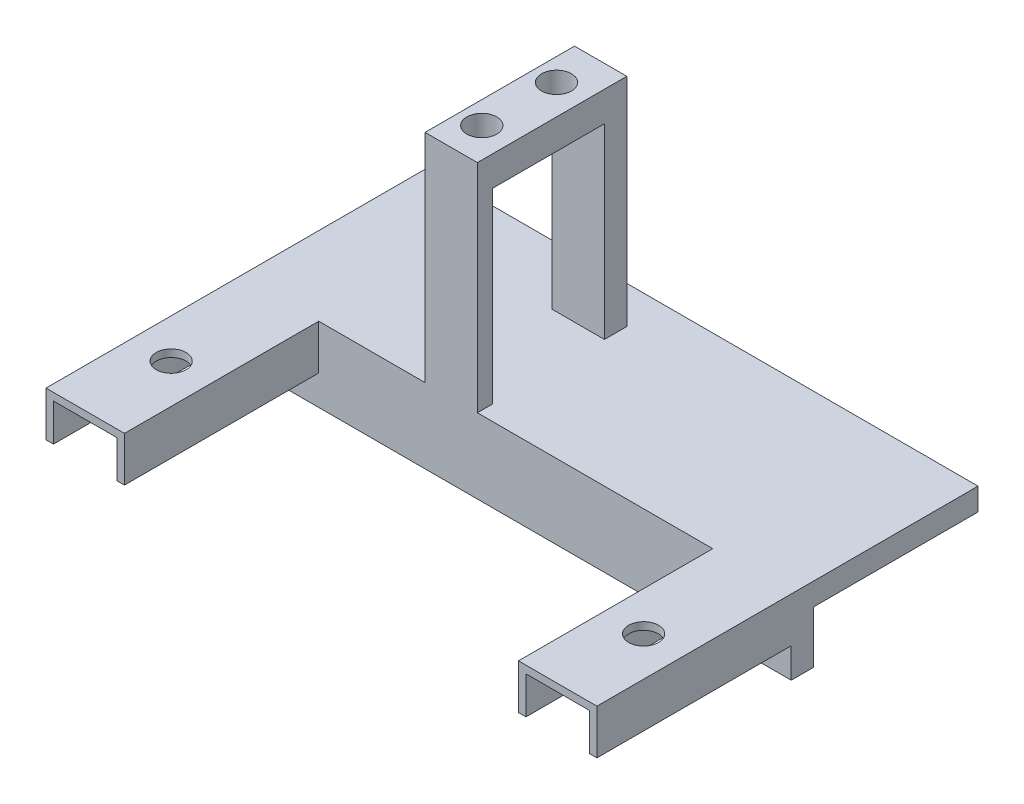
ISO-10303-21;
HEADER;
FILE_DESCRIPTION(('STEP AP214'),'2;1');
FILE_NAME('part.step','',(''),(''),'','','');
FILE_SCHEMA(('AUTOMOTIVE_DESIGN { 1 0 10303 214 1 1 1 1 }'));
ENDSEC;
DATA;
#1=APPLICATION_CONTEXT('core data for automotive mechanical design processes');
#2=APPLICATION_PROTOCOL_DEFINITION('international standard','automotive_design',2000,#1);
#3=PRODUCT_CONTEXT('',#1,'mechanical');
#4=PRODUCT('Part','Part','',(#3));
#5=PRODUCT_RELATED_PRODUCT_CATEGORY('part','',(#4));
#6=PRODUCT_DEFINITION_FORMATION('','',#4);
#7=PRODUCT_DEFINITION_CONTEXT('part definition',#1,'design');
#8=PRODUCT_DEFINITION('design','',#6,#7);
#9=PRODUCT_DEFINITION_SHAPE('','',#8);
#10=(LENGTH_UNIT() NAMED_UNIT(*) SI_UNIT(.MILLI.,.METRE.));
#11=(NAMED_UNIT(*) PLANE_ANGLE_UNIT() SI_UNIT($,.RADIAN.));
#12=(NAMED_UNIT(*) SI_UNIT($,.STERADIAN.) SOLID_ANGLE_UNIT());
#13=UNCERTAINTY_MEASURE_WITH_UNIT(LENGTH_MEASURE(1.E-05),#10,'distance_accuracy_value','');
#14=(GEOMETRIC_REPRESENTATION_CONTEXT(3) GLOBAL_UNCERTAINTY_ASSIGNED_CONTEXT((#13)) GLOBAL_UNIT_ASSIGNED_CONTEXT((#10,
#11,#12)) REPRESENTATION_CONTEXT('',''));
#15=CARTESIAN_POINT('',(0.,0.,0.));
#16=DIRECTION('',(0.,0.,1.));
#17=DIRECTION('',(1.,0.,0.));
#18=AXIS2_PLACEMENT_3D('',#15,#16,#17);
#19=CARTESIAN_POINT('',(0.,10.,3.));
#20=DIRECTION('',(0.,-1.,0.));
#21=DIRECTION('',(0.,0.,-1.));
#22=AXIS2_PLACEMENT_3D('',#19,#20,#21);
#23=PLANE('',#22);
#24=DIRECTION('',(0.,0.,-1.));
#25=VECTOR('',#24,1.);
#26=CARTESIAN_POINT('',(73.73,10.,3.));
#27=LINE('',#26,#25);
#28=CARTESIAN_POINT('',(73.73,10.,29.));
#29=VERTEX_POINT('',#28);
#30=CARTESIAN_POINT('',(73.73,10.,-22.));
#31=VERTEX_POINT('',#30);
#32=EDGE_CURVE('E510',#29,#31,#27,.T.);
#33=ORIENTED_EDGE('',*,*,#32,.T.);
#34=DIRECTION('',(1.,0.,0.));
#35=VECTOR('',#34,1.);
#36=CARTESIAN_POINT('',(73.73,10.,-22.));
#37=LINE('',#36,#35);
#38=CARTESIAN_POINT('',(0.,10.,-22.));
#39=VERTEX_POINT('',#38);
#40=EDGE_CURVE('E304',#39,#31,#37,.T.);
#41=ORIENTED_EDGE('',*,*,#40,.F.);
#42=DIRECTION('',(0.,0.,-1.));
#43=VECTOR('',#42,1.);
#44=CARTESIAN_POINT('',(0.,10.,3.));
#45=LINE('',#44,#43);
#46=CARTESIAN_POINT('',(0.,10.,29.));
#47=VERTEX_POINT('',#46);
#48=EDGE_CURVE('E499',#47,#39,#45,.T.);
#49=ORIENTED_EDGE('',*,*,#48,.F.);
#50=DIRECTION('',(-1.,0.,0.));
#51=VECTOR('',#50,1.);
#52=CARTESIAN_POINT('',(0.,10.,29.));
#53=LINE('',#52,#51);
#54=CARTESIAN_POINT('',(10.5,10.,29.));
#55=VERTEX_POINT('',#54);
#56=EDGE_CURVE('E428',#55,#47,#53,.T.);
#57=ORIENTED_EDGE('',*,*,#56,.F.);
#58=DIRECTION('',(0.,0.,-1.));
#59=VECTOR('',#58,1.);
#60=CARTESIAN_POINT('',(10.5,10.,29.));
#61=LINE('',#60,#59);
#62=CARTESIAN_POINT('',(10.5,10.,3.));
#63=VERTEX_POINT('',#62);
#64=EDGE_CURVE('E461',#55,#63,#61,.T.);
#65=ORIENTED_EDGE('',*,*,#64,.T.);
#66=DIRECTION('',(-1.,0.,0.));
#67=VECTOR('',#66,1.);
#68=CARTESIAN_POINT('',(0.,10.,3.));
#69=LINE('',#68,#67);
#70=CARTESIAN_POINT('',(24.73,10.,3.));
#71=VERTEX_POINT('',#70);
#72=EDGE_CURVE('E253',#71,#63,#69,.T.);
#73=ORIENTED_EDGE('',*,*,#72,.F.);
#74=DIRECTION('',(0.,0.,1.));
#75=VECTOR('',#74,1.);
#76=CARTESIAN_POINT('',(24.73,10.,3.));
#77=LINE('',#76,#75);
#78=CARTESIAN_POINT('',(24.73,10.,1.));
#79=VERTEX_POINT('',#78);
#80=EDGE_CURVE('E245',#79,#71,#77,.T.);
#81=ORIENTED_EDGE('',*,*,#80,.F.);
#82=DIRECTION('',(-1.,0.,0.));
#83=VECTOR('',#82,1.);
#84=CARTESIAN_POINT('',(73.73,10.,1.));
#85=LINE('',#84,#83);
#86=CARTESIAN_POINT('',(31.73,10.,1.));
#87=VERTEX_POINT('',#86);
#88=EDGE_CURVE('E69',#87,#79,#85,.T.);
#89=ORIENTED_EDGE('',*,*,#88,.F.);
#90=DIRECTION('',(0.,0.,-1.));
#91=VECTOR('',#90,1.);
#92=CARTESIAN_POINT('',(31.73,10.,3.));
#93=LINE('',#92,#91);
#94=CARTESIAN_POINT('',(31.73,10.,3.));
#95=VERTEX_POINT('',#94);
#96=EDGE_CURVE('E269',#95,#87,#93,.T.);
#97=ORIENTED_EDGE('',*,*,#96,.F.);
#98=CARTESIAN_POINT('',(63.23,10.,3.));
#99=VERTEX_POINT('',#98);
#100=EDGE_CURVE('E495',#99,#95,#69,.T.);
#101=ORIENTED_EDGE('',*,*,#100,.F.);
#102=DIRECTION('',(0.,0.,-1.));
#103=VECTOR('',#102,1.);
#104=CARTESIAN_POINT('',(63.23,10.,29.));
#105=LINE('',#104,#103);
#106=CARTESIAN_POINT('',(63.23,10.,29.));
#107=VERTEX_POINT('',#106);
#108=EDGE_CURVE('E403',#107,#99,#105,.T.);
#109=ORIENTED_EDGE('',*,*,#108,.F.);
#110=DIRECTION('',(-1.,0.,0.));
#111=VECTOR('',#110,1.);
#112=CARTESIAN_POINT('',(63.23,10.,29.));
#113=LINE('',#112,#111);
#114=EDGE_CURVE('E328',#29,#107,#113,.T.);
#115=ORIENTED_EDGE('',*,*,#114,.F.);
#116=EDGE_LOOP('',(#33,#41,#49,#57,#65,#73,#81,#89,#97,#101,#109,#115));
#117=FACE_BOUND('',#116,.T.);
#118=CARTESIAN_POINT('',(68.48,10.,17.5));
#119=DIRECTION('',(0.,1.,0.));
#120=DIRECTION('',(0.,0.,1.));
#121=AXIS2_PLACEMENT_3D('',#118,#119,#120);
#122=CIRCLE('',#121,2.);
#123=CARTESIAN_POINT('',(68.48,10.,19.5));
#124=VERTEX_POINT('',#123);
#125=EDGE_CURVE('E319',#124,#124,#122,.T.);
#126=ORIENTED_EDGE('',*,*,#125,.F.);
#127=EDGE_LOOP('',(#126));
#128=FACE_BOUND('',#127,.T.);
#129=CARTESIAN_POINT('',(31.73,10.,-14.));
#130=VERTEX_POINT('',#129);
#131=CARTESIAN_POINT('',(31.73,10.,-17.));
#132=VERTEX_POINT('',#131);
#133=EDGE_CURVE('E261',#130,#132,#93,.T.);
#134=ORIENTED_EDGE('',*,*,#133,.F.);
#135=DIRECTION('',(-1.,0.,0.));
#136=VECTOR('',#135,1.);
#137=CARTESIAN_POINT('',(73.73,10.,-14.));
#138=LINE('',#137,#136);
#139=CARTESIAN_POINT('',(24.73,10.,-14.));
#140=VERTEX_POINT('',#139);
#141=EDGE_CURVE('E239',#130,#140,#138,.T.);
#142=ORIENTED_EDGE('',*,*,#141,.T.);
#143=CARTESIAN_POINT('',(24.73,10.,-17.));
#144=VERTEX_POINT('',#143);
#145=EDGE_CURVE('E256',#144,#140,#77,.T.);
#146=ORIENTED_EDGE('',*,*,#145,.F.);
#147=DIRECTION('',(-1.,0.,0.));
#148=VECTOR('',#147,1.);
#149=CARTESIAN_POINT('',(24.73,10.,-17.));
#150=LINE('',#149,#148);
#151=EDGE_CURVE('E272',#132,#144,#150,.T.);
#152=ORIENTED_EDGE('',*,*,#151,.F.);
#153=EDGE_LOOP('',(#134,#142,#146,#152));
#154=FACE_BOUND('',#153,.T.);
#155=CARTESIAN_POINT('',(5.24999999999999,10.,17.5));
#156=DIRECTION('',(0.,1.,0.));
#157=DIRECTION('',(0.,0.,1.));
#158=AXIS2_PLACEMENT_3D('',#155,#156,#157);
#159=CIRCLE('',#158,2.);
#160=CARTESIAN_POINT('',(5.24999999999999,10.,19.5));
#161=VERTEX_POINT('',#160);
#162=EDGE_CURVE('E320',#161,#161,#159,.T.);
#163=ORIENTED_EDGE('',*,*,#162,.F.);
#164=EDGE_LOOP('',(#163));
#165=FACE_BOUND('',#164,.T.);
#166=ADVANCED_FACE('F45',(#117,#128,#154,#165),#23,.F.);
#167=CARTESIAN_POINT('',(0.,0.,3.));
#168=DIRECTION('',(0.,0.,-1.));
#169=DIRECTION('',(-1.,0.,0.));
#170=AXIS2_PLACEMENT_3D('',#167,#168,#169);
#171=PLANE('',#170);
#172=DIRECTION('',(0.,-1.,0.));
#173=VECTOR('',#172,1.);
#174=CARTESIAN_POINT('',(63.23,4.,3.));
#175=LINE('',#174,#173);
#176=CARTESIAN_POINT('',(63.23,4.,3.));
#177=VERTEX_POINT('',#176);
#178=EDGE_CURVE('E356',#99,#177,#175,.T.);
#179=ORIENTED_EDGE('',*,*,#178,.F.);
#180=ORIENTED_EDGE('',*,*,#100,.T.);
#181=DIRECTION('',(0.,-1.,0.));
#182=VECTOR('',#181,1.);
#183=CARTESIAN_POINT('',(31.73,39.,3.));
#184=LINE('',#183,#182);
#185=CARTESIAN_POINT('',(31.73,39.,3.));
#186=VERTEX_POINT('',#185);
#187=EDGE_CURVE('E285',#186,#95,#184,.T.);
#188=ORIENTED_EDGE('',*,*,#187,.F.);
#189=DIRECTION('',(1.,0.,0.));
#190=VECTOR('',#189,1.);
#191=CARTESIAN_POINT('',(24.73,39.,3.));
#192=LINE('',#191,#190);
#193=CARTESIAN_POINT('',(24.73,39.,3.));
#194=VERTEX_POINT('',#193);
#195=EDGE_CURVE('E598',#194,#186,#192,.T.);
#196=ORIENTED_EDGE('',*,*,#195,.F.);
#197=DIRECTION('',(0.,-1.,0.));
#198=VECTOR('',#197,1.);
#199=CARTESIAN_POINT('',(24.73,39.,3.));
#200=LINE('',#199,#198);
#201=EDGE_CURVE('E289',#194,#71,#200,.T.);
#202=ORIENTED_EDGE('',*,*,#201,.T.);
#203=ORIENTED_EDGE('',*,*,#72,.T.);
#204=DIRECTION('',(0.,1.,0.));
#205=VECTOR('',#204,1.);
#206=CARTESIAN_POINT('',(10.5,10.,3.));
#207=LINE('',#206,#205);
#208=CARTESIAN_POINT('',(10.5,4.,3.));
#209=VERTEX_POINT('',#208);
#210=EDGE_CURVE('E413',#209,#63,#207,.T.);
#211=ORIENTED_EDGE('',*,*,#210,.F.);
#212=DIRECTION('',(1.,0.,0.));
#213=VECTOR('',#212,1.);
#214=CARTESIAN_POINT('',(10.5,4.,3.));
#215=LINE('',#214,#213);
#216=CARTESIAN_POINT('',(9.5,4.,3.));
#217=VERTEX_POINT('',#216);
#218=EDGE_CURVE('E451',#217,#209,#215,.T.);
#219=ORIENTED_EDGE('',*,*,#218,.F.);
#220=DIRECTION('',(0.,-1.,0.));
#221=VECTOR('',#220,1.);
#222=CARTESIAN_POINT('',(9.5,4.,3.));
#223=LINE('',#222,#221);
#224=CARTESIAN_POINT('',(9.5,9.,3.));
#225=VERTEX_POINT('',#224);
#226=EDGE_CURVE('E447',#225,#217,#223,.T.);
#227=ORIENTED_EDGE('',*,*,#226,.F.);
#228=DIRECTION('',(1.,0.,0.));
#229=VECTOR('',#228,1.);
#230=CARTESIAN_POINT('',(9.5,9.,3.));
#231=LINE('',#230,#229);
#232=CARTESIAN_POINT('',(0.999999999999999,9.,3.));
#233=VERTEX_POINT('',#232);
#234=EDGE_CURVE('E443',#233,#225,#231,.T.);
#235=ORIENTED_EDGE('',*,*,#234,.F.);
#236=DIRECTION('',(0.,1.,0.));
#237=VECTOR('',#236,1.);
#238=CARTESIAN_POINT('',(0.999999999999999,9.,3.));
#239=LINE('',#238,#237);
#240=CARTESIAN_POINT('',(1.,4.,3.));
#241=VERTEX_POINT('',#240);
#242=EDGE_CURVE('E439',#241,#233,#239,.T.);
#243=ORIENTED_EDGE('',*,*,#242,.F.);
#244=DIRECTION('',(1.,0.,0.));
#245=VECTOR('',#244,1.);
#246=CARTESIAN_POINT('',(1.,4.,3.));
#247=LINE('',#246,#245);
#248=CARTESIAN_POINT('',(0.,4.,3.));
#249=VERTEX_POINT('',#248);
#250=EDGE_CURVE('E407',#249,#241,#247,.T.);
#251=ORIENTED_EDGE('',*,*,#250,.F.);
#252=DIRECTION('',(0.,-1.,0.));
#253=VECTOR('',#252,1.);
#254=CARTESIAN_POINT('',(0.,0.,3.));
#255=LINE('',#254,#253);
#256=CARTESIAN_POINT('',(0.,0.,3.));
#257=VERTEX_POINT('',#256);
#258=EDGE_CURVE('E485',#249,#257,#255,.T.);
#259=ORIENTED_EDGE('',*,*,#258,.T.);
#260=DIRECTION('',(1.,0.,0.));
#261=VECTOR('',#260,1.);
#262=CARTESIAN_POINT('',(0.,0.,3.));
#263=LINE('',#262,#261);
#264=CARTESIAN_POINT('',(73.73,0.,3.));
#265=VERTEX_POINT('',#264);
#266=EDGE_CURVE('E488',#257,#265,#263,.T.);
#267=ORIENTED_EDGE('',*,*,#266,.T.);
#268=DIRECTION('',(0.,1.,0.));
#269=VECTOR('',#268,1.);
#270=CARTESIAN_POINT('',(73.73,0.,3.));
#271=LINE('',#270,#269);
#272=CARTESIAN_POINT('',(73.73,4.,3.));
#273=VERTEX_POINT('',#272);
#274=EDGE_CURVE('E492',#265,#273,#271,.T.);
#275=ORIENTED_EDGE('',*,*,#274,.T.);
#276=DIRECTION('',(1.,0.,0.));
#277=VECTOR('',#276,1.);
#278=CARTESIAN_POINT('',(73.73,4.,3.));
#279=LINE('',#278,#277);
#280=CARTESIAN_POINT('',(72.73,4.,3.));
#281=VERTEX_POINT('',#280);
#282=EDGE_CURVE('E333',#281,#273,#279,.T.);
#283=ORIENTED_EDGE('',*,*,#282,.F.);
#284=DIRECTION('',(0.,-1.,0.));
#285=VECTOR('',#284,1.);
#286=CARTESIAN_POINT('',(72.73,4.,3.));
#287=LINE('',#286,#285);
#288=CARTESIAN_POINT('',(72.73,9.,3.));
#289=VERTEX_POINT('',#288);
#290=EDGE_CURVE('E373',#289,#281,#287,.T.);
#291=ORIENTED_EDGE('',*,*,#290,.F.);
#292=DIRECTION('',(1.,0.,0.));
#293=VECTOR('',#292,1.);
#294=CARTESIAN_POINT('',(72.73,9.,3.));
#295=LINE('',#294,#293);
#296=CARTESIAN_POINT('',(64.23,9.,3.));
#297=VERTEX_POINT('',#296);
#298=EDGE_CURVE('E369',#297,#289,#295,.T.);
#299=ORIENTED_EDGE('',*,*,#298,.F.);
#300=DIRECTION('',(0.,1.,0.));
#301=VECTOR('',#300,1.);
#302=CARTESIAN_POINT('',(64.23,9.,3.));
#303=LINE('',#302,#301);
#304=CARTESIAN_POINT('',(64.23,4.,3.));
#305=VERTEX_POINT('',#304);
#306=EDGE_CURVE('E365',#305,#297,#303,.T.);
#307=ORIENTED_EDGE('',*,*,#306,.F.);
#308=DIRECTION('',(1.,0.,0.));
#309=VECTOR('',#308,1.);
#310=CARTESIAN_POINT('',(64.23,4.,3.));
#311=LINE('',#310,#309);
#312=EDGE_CURVE('E360',#177,#305,#311,.T.);
#313=ORIENTED_EDGE('',*,*,#312,.F.);
#314=EDGE_LOOP('',(#179,#180,#188,#196,#202,#203,#211,#219,#227,#235,#243,#251,#259,#267,#275,
#283,#291,#299,#307,#313));
#315=FACE_BOUND('',#314,.T.);
#316=ADVANCED_FACE('F542',(#315),#171,.F.);
#317=CARTESIAN_POINT('',(0.,0.,3.));
#318=DIRECTION('',(1.,0.,0.));
#319=DIRECTION('',(0.,0.,-1.));
#320=AXIS2_PLACEMENT_3D('',#317,#318,#319);
#321=PLANE('',#320);
#322=ORIENTED_EDGE('',*,*,#48,.T.);
#323=DIRECTION('',(0.,1.,0.));
#324=VECTOR('',#323,1.);
#325=CARTESIAN_POINT('',(0.,10.,-22.));
#326=LINE('',#325,#324);
#327=CARTESIAN_POINT('',(0.,7.,-22.));
#328=VERTEX_POINT('',#327);
#329=EDGE_CURVE('E300',#328,#39,#326,.T.);
#330=ORIENTED_EDGE('',*,*,#329,.F.);
#331=DIRECTION('',(0.,0.,1.));
#332=VECTOR('',#331,1.);
#333=CARTESIAN_POINT('',(0.,7.,-22.));
#334=LINE('',#333,#332);
#335=CARTESIAN_POINT('',(0.,7.,0.));
#336=VERTEX_POINT('',#335);
#337=EDGE_CURVE('E308',#328,#336,#334,.T.);
#338=ORIENTED_EDGE('',*,*,#337,.T.);
#339=DIRECTION('',(0.,-1.,0.));
#340=VECTOR('',#339,1.);
#341=CARTESIAN_POINT('',(0.,0.,0.));
#342=LINE('',#341,#340);
#343=CARTESIAN_POINT('',(0.,0.,0.));
#344=VERTEX_POINT('',#343);
#345=EDGE_CURVE('E484',#336,#344,#342,.T.);
#346=ORIENTED_EDGE('',*,*,#345,.T.);
#347=DIRECTION('',(0.,0.,-1.));
#348=VECTOR('',#347,1.);
#349=CARTESIAN_POINT('',(0.,0.,3.));
#350=LINE('',#349,#348);
#351=EDGE_CURVE('E517',#257,#344,#350,.T.);
#352=ORIENTED_EDGE('',*,*,#351,.F.);
#353=ORIENTED_EDGE('',*,*,#258,.F.);
#354=DIRECTION('',(0.,0.,-1.));
#355=VECTOR('',#354,1.);
#356=CARTESIAN_POINT('',(0.,4.,29.));
#357=LINE('',#356,#355);
#358=CARTESIAN_POINT('',(0.,4.,29.));
#359=VERTEX_POINT('',#358);
#360=EDGE_CURVE('E435',#359,#249,#357,.T.);
#361=ORIENTED_EDGE('',*,*,#360,.F.);
#362=DIRECTION('',(0.,-1.,0.));
#363=VECTOR('',#362,1.);
#364=CARTESIAN_POINT('',(0.,4.,29.));
#365=LINE('',#364,#363);
#366=EDGE_CURVE('E432',#47,#359,#365,.T.);
#367=ORIENTED_EDGE('',*,*,#366,.F.);
#368=EDGE_LOOP('',(#322,#330,#338,#346,#352,#353,#361,#367));
#369=FACE_BOUND('',#368,.T.);
#370=ADVANCED_FACE('F47',(#369),#321,.F.);
#371=CARTESIAN_POINT('',(0.,0.,3.));
#372=DIRECTION('',(0.,1.,0.));
#373=DIRECTION('',(0.,0.,1.));
#374=AXIS2_PLACEMENT_3D('',#371,#372,#373);
#375=PLANE('',#374);
#376=DIRECTION('',(1.,0.,0.));
#377=VECTOR('',#376,1.);
#378=CARTESIAN_POINT('',(0.,0.,0.));
#379=LINE('',#378,#377);
#380=CARTESIAN_POINT('',(73.73,0.,0.));
#381=VERTEX_POINT('',#380);
#382=EDGE_CURVE('E502',#344,#381,#379,.T.);
#383=ORIENTED_EDGE('',*,*,#382,.T.);
#384=DIRECTION('',(0.,0.,-1.));
#385=VECTOR('',#384,1.);
#386=CARTESIAN_POINT('',(73.73,0.,3.));
#387=LINE('',#386,#385);
#388=EDGE_CURVE('E513',#265,#381,#387,.T.);
#389=ORIENTED_EDGE('',*,*,#388,.F.);
#390=ORIENTED_EDGE('',*,*,#266,.F.);
#391=ORIENTED_EDGE('',*,*,#351,.T.);
#392=EDGE_LOOP('',(#383,#389,#390,#391));
#393=FACE_BOUND('',#392,.T.);
#394=ADVANCED_FACE('F660',(#393),#375,.F.);
#395=CARTESIAN_POINT('',(73.73,0.,3.));
#396=DIRECTION('',(-1.,0.,0.));
#397=DIRECTION('',(0.,-1.,0.));
#398=AXIS2_PLACEMENT_3D('',#395,#396,#397);
#399=PLANE('',#398);
#400=DIRECTION('',(0.,1.,0.));
#401=VECTOR('',#400,1.);
#402=CARTESIAN_POINT('',(73.73,0.,0.));
#403=LINE('',#402,#401);
#404=CARTESIAN_POINT('',(73.73,7.,0.));
#405=VERTEX_POINT('',#404);
#406=EDGE_CURVE('E489',#381,#405,#403,.T.);
#407=ORIENTED_EDGE('',*,*,#406,.T.);
#408=DIRECTION('',(0.,0.,1.));
#409=VECTOR('',#408,1.);
#410=CARTESIAN_POINT('',(73.73,7.,-22.));
#411=LINE('',#410,#409);
#412=CARTESIAN_POINT('',(73.73,7.,-22.));
#413=VERTEX_POINT('',#412);
#414=EDGE_CURVE('E315',#413,#405,#411,.T.);
#415=ORIENTED_EDGE('',*,*,#414,.F.);
#416=DIRECTION('',(0.,-1.,0.));
#417=VECTOR('',#416,1.);
#418=CARTESIAN_POINT('',(73.73,10.,-22.));
#419=LINE('',#418,#417);
#420=EDGE_CURVE('E293',#31,#413,#419,.T.);
#421=ORIENTED_EDGE('',*,*,#420,.F.);
#422=ORIENTED_EDGE('',*,*,#32,.F.);
#423=DIRECTION('',(0.,1.,0.));
#424=VECTOR('',#423,1.);
#425=CARTESIAN_POINT('',(73.73,10.,29.));
#426=LINE('',#425,#424);
#427=CARTESIAN_POINT('',(73.73,4.,29.));
#428=VERTEX_POINT('',#427);
#429=EDGE_CURVE('E351',#428,#29,#426,.T.);
#430=ORIENTED_EDGE('',*,*,#429,.F.);
#431=DIRECTION('',(0.,0.,-1.));
#432=VECTOR('',#431,1.);
#433=CARTESIAN_POINT('',(73.73,4.,29.));
#434=LINE('',#433,#432);
#435=EDGE_CURVE('E355',#428,#273,#434,.T.);
#436=ORIENTED_EDGE('',*,*,#435,.T.);
#437=ORIENTED_EDGE('',*,*,#274,.F.);
#438=ORIENTED_EDGE('',*,*,#388,.T.);
#439=EDGE_LOOP('',(#407,#415,#421,#422,#430,#436,#437,#438));
#440=FACE_BOUND('',#439,.T.);
#441=ADVANCED_FACE('F554',(#440),#399,.F.);
#442=CARTESIAN_POINT('',(0.,0.,0.));
#443=DIRECTION('',(0.,0.,-1.));
#444=DIRECTION('',(-1.,0.,0.));
#445=AXIS2_PLACEMENT_3D('',#442,#443,#444);
#446=PLANE('',#445);
#447=DIRECTION('',(-1.,0.,0.));
#448=VECTOR('',#447,1.);
#449=CARTESIAN_POINT('',(73.73,7.,0.));
#450=LINE('',#449,#448);
#451=EDGE_CURVE('E292',#405,#336,#450,.T.);
#452=ORIENTED_EDGE('',*,*,#451,.F.);
#453=ORIENTED_EDGE('',*,*,#406,.F.);
#454=ORIENTED_EDGE('',*,*,#382,.F.);
#455=ORIENTED_EDGE('',*,*,#345,.F.);
#456=EDGE_LOOP('',(#452,#453,#454,#455));
#457=FACE_BOUND('',#456,.T.);
#458=ADVANCED_FACE('F659',(#457),#446,.T.);
#459=CARTESIAN_POINT('',(1.,4.,29.));
#460=DIRECTION('',(0.,1.,0.));
#461=DIRECTION('',(0.,0.,1.));
#462=AXIS2_PLACEMENT_3D('',#459,#460,#461);
#463=PLANE('',#462);
#464=ORIENTED_EDGE('',*,*,#250,.T.);
#465=DIRECTION('',(0.,0.,-1.));
#466=VECTOR('',#465,1.);
#467=CARTESIAN_POINT('',(1.,4.,29.));
#468=LINE('',#467,#466);
#469=CARTESIAN_POINT('',(1.,4.,29.));
#470=VERTEX_POINT('',#469);
#471=EDGE_CURVE('E480',#470,#241,#468,.T.);
#472=ORIENTED_EDGE('',*,*,#471,.F.);
#473=DIRECTION('',(1.,0.,0.));
#474=VECTOR('',#473,1.);
#475=CARTESIAN_POINT('',(1.,4.,29.));
#476=LINE('',#475,#474);
#477=EDGE_CURVE('E408',#359,#470,#476,.T.);
#478=ORIENTED_EDGE('',*,*,#477,.F.);
#479=ORIENTED_EDGE('',*,*,#360,.T.);
#480=EDGE_LOOP('',(#464,#472,#478,#479));
#481=FACE_BOUND('',#480,.T.);
#482=ADVANCED_FACE('F575',(#481),#463,.F.);
#483=CARTESIAN_POINT('',(0.999999999999999,9.,29.));
#484=DIRECTION('',(-1.,0.,0.));
#485=DIRECTION('',(0.,-1.,0.));
#486=AXIS2_PLACEMENT_3D('',#483,#484,#485);
#487=PLANE('',#486);
#488=ORIENTED_EDGE('',*,*,#242,.T.);
#489=DIRECTION('',(0.,0.,-1.));
#490=VECTOR('',#489,1.);
#491=CARTESIAN_POINT('',(0.999999999999999,9.,29.));
#492=LINE('',#491,#490);
#493=CARTESIAN_POINT('',(0.999999999999999,9.,29.));
#494=VERTEX_POINT('',#493);
#495=EDGE_CURVE('E476',#494,#233,#492,.T.);
#496=ORIENTED_EDGE('',*,*,#495,.F.);
#497=DIRECTION('',(0.,1.,0.));
#498=VECTOR('',#497,1.);
#499=CARTESIAN_POINT('',(0.999999999999999,9.,29.));
#500=LINE('',#499,#498);
#501=EDGE_CURVE('E412',#470,#494,#500,.T.);
#502=ORIENTED_EDGE('',*,*,#501,.F.);
#503=ORIENTED_EDGE('',*,*,#471,.T.);
#504=EDGE_LOOP('',(#488,#496,#502,#503));
#505=FACE_BOUND('',#504,.T.);
#506=ADVANCED_FACE('F580',(#505),#487,.F.);
#507=CARTESIAN_POINT('',(9.5,9.,29.));
#508=DIRECTION('',(0.,1.,0.));
#509=DIRECTION('',(-1.,0.,0.));
#510=AXIS2_PLACEMENT_3D('',#507,#508,#509);
#511=PLANE('',#510);
#512=CARTESIAN_POINT('',(5.24999999999999,9.,17.5));
#513=DIRECTION('',(0.,1.,0.));
#514=DIRECTION('',(-1.,0.,0.));
#515=AXIS2_PLACEMENT_3D('',#512,#513,#514);
#516=CIRCLE('',#515,2.);
#517=CARTESIAN_POINT('',(3.24999999999999,9.,17.5));
#518=VERTEX_POINT('',#517);
#519=EDGE_CURVE('E361',#518,#518,#516,.T.);
#520=ORIENTED_EDGE('',*,*,#519,.T.);
#521=EDGE_LOOP('',(#520));
#522=FACE_BOUND('',#521,.T.);
#523=ORIENTED_EDGE('',*,*,#234,.T.);
#524=DIRECTION('',(0.,0.,-1.));
#525=VECTOR('',#524,1.);
#526=CARTESIAN_POINT('',(9.5,9.,29.));
#527=LINE('',#526,#525);
#528=CARTESIAN_POINT('',(9.5,9.,29.));
#529=VERTEX_POINT('',#528);
#530=EDGE_CURVE('E472',#529,#225,#527,.T.);
#531=ORIENTED_EDGE('',*,*,#530,.F.);
#532=DIRECTION('',(1.,0.,0.));
#533=VECTOR('',#532,1.);
#534=CARTESIAN_POINT('',(9.5,9.,29.));
#535=LINE('',#534,#533);
#536=EDGE_CURVE('E416',#494,#529,#535,.T.);
#537=ORIENTED_EDGE('',*,*,#536,.F.);
#538=ORIENTED_EDGE('',*,*,#495,.T.);
#539=EDGE_LOOP('',(#523,#531,#537,#538));
#540=FACE_BOUND('',#539,.T.);
#541=ADVANCED_FACE('F582',(#522,#540),#511,.F.);
#542=CARTESIAN_POINT('',(9.5,4.,29.));
#543=DIRECTION('',(1.,0.,0.));
#544=DIRECTION('',(0.,0.,-1.));
#545=AXIS2_PLACEMENT_3D('',#542,#543,#544);
#546=PLANE('',#545);
#547=ORIENTED_EDGE('',*,*,#226,.T.);
#548=DIRECTION('',(0.,0.,-1.));
#549=VECTOR('',#548,1.);
#550=CARTESIAN_POINT('',(9.5,4.,29.));
#551=LINE('',#550,#549);
#552=CARTESIAN_POINT('',(9.5,4.,29.));
#553=VERTEX_POINT('',#552);
#554=EDGE_CURVE('E468',#553,#217,#551,.T.);
#555=ORIENTED_EDGE('',*,*,#554,.F.);
#556=DIRECTION('',(0.,-1.,0.));
#557=VECTOR('',#556,1.);
#558=CARTESIAN_POINT('',(9.5,4.,29.));
#559=LINE('',#558,#557);
#560=EDGE_CURVE('E419',#529,#553,#559,.T.);
#561=ORIENTED_EDGE('',*,*,#560,.F.);
#562=ORIENTED_EDGE('',*,*,#530,.T.);
#563=EDGE_LOOP('',(#547,#555,#561,#562));
#564=FACE_BOUND('',#563,.T.);
#565=ADVANCED_FACE('F586',(#564),#546,.F.);
#566=CARTESIAN_POINT('',(10.5,4.,29.));
#567=DIRECTION('',(0.,1.,0.));
#568=DIRECTION('',(-1.,0.,0.));
#569=AXIS2_PLACEMENT_3D('',#566,#567,#568);
#570=PLANE('',#569);
#571=ORIENTED_EDGE('',*,*,#218,.T.);
#572=DIRECTION('',(0.,0.,-1.));
#573=VECTOR('',#572,1.);
#574=CARTESIAN_POINT('',(10.5,4.,29.));
#575=LINE('',#574,#573);
#576=CARTESIAN_POINT('',(10.5,4.,29.));
#577=VERTEX_POINT('',#576);
#578=EDGE_CURVE('E464',#577,#209,#575,.T.);
#579=ORIENTED_EDGE('',*,*,#578,.F.);
#580=DIRECTION('',(1.,0.,0.));
#581=VECTOR('',#580,1.);
#582=CARTESIAN_POINT('',(10.5,4.,29.));
#583=LINE('',#582,#581);
#584=EDGE_CURVE('E422',#553,#577,#583,.T.);
#585=ORIENTED_EDGE('',*,*,#584,.F.);
#586=ORIENTED_EDGE('',*,*,#554,.T.);
#587=EDGE_LOOP('',(#571,#579,#585,#586));
#588=FACE_BOUND('',#587,.T.);
#589=ADVANCED_FACE('F590',(#588),#570,.F.);
#590=CARTESIAN_POINT('',(10.5,10.,29.));
#591=DIRECTION('',(-1.,0.,0.));
#592=DIRECTION('',(0.,0.,1.));
#593=AXIS2_PLACEMENT_3D('',#590,#591,#592);
#594=PLANE('',#593);
#595=ORIENTED_EDGE('',*,*,#210,.T.);
#596=ORIENTED_EDGE('',*,*,#64,.F.);
#597=DIRECTION('',(0.,1.,0.));
#598=VECTOR('',#597,1.);
#599=CARTESIAN_POINT('',(10.5,10.,29.));
#600=LINE('',#599,#598);
#601=EDGE_CURVE('E425',#577,#55,#600,.T.);
#602=ORIENTED_EDGE('',*,*,#601,.F.);
#603=ORIENTED_EDGE('',*,*,#578,.T.);
#604=EDGE_LOOP('',(#595,#596,#602,#603));
#605=FACE_BOUND('',#604,.T.);
#606=ADVANCED_FACE('F592',(#605),#594,.F.);
#607=CARTESIAN_POINT('',(0.,0.,29.));
#608=DIRECTION('',(0.,0.,-1.));
#609=DIRECTION('',(-1.,0.,0.));
#610=AXIS2_PLACEMENT_3D('',#607,#608,#609);
#611=PLANE('',#610);
#612=ORIENTED_EDGE('',*,*,#477,.T.);
#613=ORIENTED_EDGE('',*,*,#501,.T.);
#614=ORIENTED_EDGE('',*,*,#536,.T.);
#615=ORIENTED_EDGE('',*,*,#560,.T.);
#616=ORIENTED_EDGE('',*,*,#584,.T.);
#617=ORIENTED_EDGE('',*,*,#601,.T.);
#618=ORIENTED_EDGE('',*,*,#56,.T.);
#619=ORIENTED_EDGE('',*,*,#366,.T.);
#620=EDGE_LOOP('',(#612,#613,#614,#615,#616,#617,#618,#619));
#621=FACE_BOUND('',#620,.T.);
#622=ADVANCED_FACE('F566',(#621),#611,.F.);
#623=CARTESIAN_POINT('',(63.23,4.,29.));
#624=DIRECTION('',(1.,0.,0.));
#625=DIRECTION('',(0.,0.,-1.));
#626=AXIS2_PLACEMENT_3D('',#623,#624,#625);
#627=PLANE('',#626);
#628=ORIENTED_EDGE('',*,*,#178,.T.);
#629=DIRECTION('',(0.,0.,-1.));
#630=VECTOR('',#629,1.);
#631=CARTESIAN_POINT('',(63.23,4.,29.));
#632=LINE('',#631,#630);
#633=CARTESIAN_POINT('',(63.23,4.,29.));
#634=VERTEX_POINT('',#633);
#635=EDGE_CURVE('E399',#634,#177,#632,.T.);
#636=ORIENTED_EDGE('',*,*,#635,.F.);
#637=DIRECTION('',(0.,-1.,0.));
#638=VECTOR('',#637,1.);
#639=CARTESIAN_POINT('',(63.23,4.,29.));
#640=LINE('',#639,#638);
#641=EDGE_CURVE('E332',#107,#634,#640,.T.);
#642=ORIENTED_EDGE('',*,*,#641,.F.);
#643=ORIENTED_EDGE('',*,*,#108,.T.);
#644=EDGE_LOOP('',(#628,#636,#642,#643));
#645=FACE_BOUND('',#644,.T.);
#646=ADVANCED_FACE('F545',(#645),#627,.F.);
#647=CARTESIAN_POINT('',(64.23,4.,29.));
#648=DIRECTION('',(0.,1.,0.));
#649=DIRECTION('',(0.,0.,1.));
#650=AXIS2_PLACEMENT_3D('',#647,#648,#649);
#651=PLANE('',#650);
#652=ORIENTED_EDGE('',*,*,#312,.T.);
#653=DIRECTION('',(0.,0.,-1.));
#654=VECTOR('',#653,1.);
#655=CARTESIAN_POINT('',(64.23,4.,29.));
#656=LINE('',#655,#654);
#657=CARTESIAN_POINT('',(64.23,4.,29.));
#658=VERTEX_POINT('',#657);
#659=EDGE_CURVE('E395',#658,#305,#656,.T.);
#660=ORIENTED_EDGE('',*,*,#659,.F.);
#661=DIRECTION('',(1.,0.,0.));
#662=VECTOR('',#661,1.);
#663=CARTESIAN_POINT('',(64.23,4.,29.));
#664=LINE('',#663,#662);
#665=EDGE_CURVE('E336',#634,#658,#664,.T.);
#666=ORIENTED_EDGE('',*,*,#665,.F.);
#667=ORIENTED_EDGE('',*,*,#635,.T.);
#668=EDGE_LOOP('',(#652,#660,#666,#667));
#669=FACE_BOUND('',#668,.T.);
#670=ADVANCED_FACE('F708',(#669),#651,.F.);
#671=CARTESIAN_POINT('',(64.23,9.,29.));
#672=DIRECTION('',(-1.,0.,0.));
#673=DIRECTION('',(0.,0.,1.));
#674=AXIS2_PLACEMENT_3D('',#671,#672,#673);
#675=PLANE('',#674);
#676=ORIENTED_EDGE('',*,*,#306,.T.);
#677=DIRECTION('',(0.,0.,-1.));
#678=VECTOR('',#677,1.);
#679=CARTESIAN_POINT('',(64.23,9.,29.));
#680=LINE('',#679,#678);
#681=CARTESIAN_POINT('',(64.23,9.,29.));
#682=VERTEX_POINT('',#681);
#683=EDGE_CURVE('E391',#682,#297,#680,.T.);
#684=ORIENTED_EDGE('',*,*,#683,.F.);
#685=DIRECTION('',(0.,1.,0.));
#686=VECTOR('',#685,1.);
#687=CARTESIAN_POINT('',(64.23,9.,29.));
#688=LINE('',#687,#686);
#689=EDGE_CURVE('E339',#658,#682,#688,.T.);
#690=ORIENTED_EDGE('',*,*,#689,.F.);
#691=ORIENTED_EDGE('',*,*,#659,.T.);
#692=EDGE_LOOP('',(#676,#684,#690,#691));
#693=FACE_BOUND('',#692,.T.);
#694=ADVANCED_FACE('F704',(#693),#675,.F.);
#695=CARTESIAN_POINT('',(72.73,9.,29.));
#696=DIRECTION('',(0.,1.,0.));
#697=DIRECTION('',(-1.,0.,0.));
#698=AXIS2_PLACEMENT_3D('',#695,#696,#697);
#699=PLANE('',#698);
#700=CARTESIAN_POINT('',(68.48,9.,17.5));
#701=DIRECTION('',(0.,1.,0.));
#702=DIRECTION('',(-1.,0.,0.));
#703=AXIS2_PLACEMENT_3D('',#700,#701,#702);
#704=CIRCLE('',#703,2.);
#705=CARTESIAN_POINT('',(66.48,9.,17.5));
#706=VERTEX_POINT('',#705);
#707=EDGE_CURVE('E324',#706,#706,#704,.T.);
#708=ORIENTED_EDGE('',*,*,#707,.T.);
#709=EDGE_LOOP('',(#708));
#710=FACE_BOUND('',#709,.T.);
#711=ORIENTED_EDGE('',*,*,#298,.T.);
#712=DIRECTION('',(0.,0.,-1.));
#713=VECTOR('',#712,1.);
#714=CARTESIAN_POINT('',(72.73,9.,29.));
#715=LINE('',#714,#713);
#716=CARTESIAN_POINT('',(72.73,9.,29.));
#717=VERTEX_POINT('',#716);
#718=EDGE_CURVE('E387',#717,#289,#715,.T.);
#719=ORIENTED_EDGE('',*,*,#718,.F.);
#720=DIRECTION('',(1.,0.,0.));
#721=VECTOR('',#720,1.);
#722=CARTESIAN_POINT('',(72.73,9.,29.));
#723=LINE('',#722,#721);
#724=EDGE_CURVE('E342',#682,#717,#723,.T.);
#725=ORIENTED_EDGE('',*,*,#724,.F.);
#726=ORIENTED_EDGE('',*,*,#683,.T.);
#727=EDGE_LOOP('',(#711,#719,#725,#726));
#728=FACE_BOUND('',#727,.T.);
#729=ADVANCED_FACE('F700',(#710,#728),#699,.F.);
#730=CARTESIAN_POINT('',(72.73,4.,29.));
#731=DIRECTION('',(1.,0.,0.));
#732=DIRECTION('',(0.,0.,-1.));
#733=AXIS2_PLACEMENT_3D('',#730,#731,#732);
#734=PLANE('',#733);
#735=ORIENTED_EDGE('',*,*,#290,.T.);
#736=DIRECTION('',(0.,0.,-1.));
#737=VECTOR('',#736,1.);
#738=CARTESIAN_POINT('',(72.73,4.,29.));
#739=LINE('',#738,#737);
#740=CARTESIAN_POINT('',(72.73,4.,29.));
#741=VERTEX_POINT('',#740);
#742=EDGE_CURVE('E383',#741,#281,#739,.T.);
#743=ORIENTED_EDGE('',*,*,#742,.F.);
#744=DIRECTION('',(0.,-1.,0.));
#745=VECTOR('',#744,1.);
#746=CARTESIAN_POINT('',(72.73,4.,29.));
#747=LINE('',#746,#745);
#748=EDGE_CURVE('E345',#717,#741,#747,.T.);
#749=ORIENTED_EDGE('',*,*,#748,.F.);
#750=ORIENTED_EDGE('',*,*,#718,.T.);
#751=EDGE_LOOP('',(#735,#743,#749,#750));
#752=FACE_BOUND('',#751,.T.);
#753=ADVANCED_FACE('F696',(#752),#734,.F.);
#754=CARTESIAN_POINT('',(73.73,4.,29.));
#755=DIRECTION('',(0.,1.,0.));
#756=DIRECTION('',(0.,0.,1.));
#757=AXIS2_PLACEMENT_3D('',#754,#755,#756);
#758=PLANE('',#757);
#759=ORIENTED_EDGE('',*,*,#282,.T.);
#760=ORIENTED_EDGE('',*,*,#435,.F.);
#761=DIRECTION('',(1.,0.,0.));
#762=VECTOR('',#761,1.);
#763=CARTESIAN_POINT('',(73.73,4.,29.));
#764=LINE('',#763,#762);
#765=EDGE_CURVE('E348',#741,#428,#764,.T.);
#766=ORIENTED_EDGE('',*,*,#765,.F.);
#767=ORIENTED_EDGE('',*,*,#742,.T.);
#768=EDGE_LOOP('',(#759,#760,#766,#767));
#769=FACE_BOUND('',#768,.T.);
#770=ADVANCED_FACE('F693',(#769),#758,.F.);
#771=CARTESIAN_POINT('',(0.,0.,29.));
#772=DIRECTION('',(0.,0.,-1.));
#773=DIRECTION('',(-1.,0.,0.));
#774=AXIS2_PLACEMENT_3D('',#771,#772,#773);
#775=PLANE('',#774);
#776=ORIENTED_EDGE('',*,*,#114,.T.);
#777=ORIENTED_EDGE('',*,*,#641,.T.);
#778=ORIENTED_EDGE('',*,*,#665,.T.);
#779=ORIENTED_EDGE('',*,*,#689,.T.);
#780=ORIENTED_EDGE('',*,*,#724,.T.);
#781=ORIENTED_EDGE('',*,*,#748,.T.);
#782=ORIENTED_EDGE('',*,*,#765,.T.);
#783=ORIENTED_EDGE('',*,*,#429,.T.);
#784=EDGE_LOOP('',(#776,#777,#778,#779,#780,#781,#782,#783));
#785=FACE_BOUND('',#784,.T.);
#786=ADVANCED_FACE('F549',(#785),#775,.F.);
#787=CARTESIAN_POINT('',(68.48,0.,17.5));
#788=DIRECTION('',(0.,1.,0.));
#789=DIRECTION('',(0.,0.,1.));
#790=AXIS2_PLACEMENT_3D('',#787,#788,#789);
#791=CYLINDRICAL_SURFACE('',#790,2.);
#792=ORIENTED_EDGE('',*,*,#125,.T.);
#793=EDGE_LOOP('',(#792));
#794=FACE_BOUND('',#793,.T.);
#795=ORIENTED_EDGE('',*,*,#707,.F.);
#796=EDGE_LOOP('',(#795));
#797=FACE_BOUND('',#796,.T.);
#798=ADVANCED_FACE('F683',(#794,#797),#791,.F.);
#799=CARTESIAN_POINT('',(5.24999999999999,0.,17.5));
#800=DIRECTION('',(0.,1.,0.));
#801=DIRECTION('',(0.,0.,1.));
#802=AXIS2_PLACEMENT_3D('',#799,#800,#801);
#803=CYLINDRICAL_SURFACE('',#802,2.);
#804=ORIENTED_EDGE('',*,*,#162,.T.);
#805=EDGE_LOOP('',(#804));
#806=FACE_BOUND('',#805,.T.);
#807=ORIENTED_EDGE('',*,*,#519,.F.);
#808=EDGE_LOOP('',(#807));
#809=FACE_BOUND('',#808,.T.);
#810=ADVANCED_FACE('F675',(#806,#809),#803,.F.);
#811=CARTESIAN_POINT('',(73.73,7.,-22.));
#812=DIRECTION('',(0.,1.,0.));
#813=DIRECTION('',(0.,0.,1.));
#814=AXIS2_PLACEMENT_3D('',#811,#812,#813);
#815=PLANE('',#814);
#816=ORIENTED_EDGE('',*,*,#451,.T.);
#817=ORIENTED_EDGE('',*,*,#337,.F.);
#818=DIRECTION('',(-1.,0.,0.));
#819=VECTOR('',#818,1.);
#820=CARTESIAN_POINT('',(73.73,7.,-22.));
#821=LINE('',#820,#819);
#822=EDGE_CURVE('E297',#413,#328,#821,.T.);
#823=ORIENTED_EDGE('',*,*,#822,.F.);
#824=ORIENTED_EDGE('',*,*,#414,.T.);
#825=EDGE_LOOP('',(#816,#817,#823,#824));
#826=FACE_BOUND('',#825,.T.);
#827=ADVANCED_FACE('F673',(#826),#815,.F.);
#828=CARTESIAN_POINT('',(0.,0.,-22.));
#829=DIRECTION('',(0.,0.,-1.));
#830=DIRECTION('',(-1.,0.,0.));
#831=AXIS2_PLACEMENT_3D('',#828,#829,#830);
#832=PLANE('',#831);
#833=ORIENTED_EDGE('',*,*,#420,.T.);
#834=ORIENTED_EDGE('',*,*,#822,.T.);
#835=ORIENTED_EDGE('',*,*,#329,.T.);
#836=ORIENTED_EDGE('',*,*,#40,.T.);
#837=EDGE_LOOP('',(#833,#834,#835,#836));
#838=FACE_BOUND('',#837,.T.);
#839=ADVANCED_FACE('F559',(#838),#832,.T.);
#840=CARTESIAN_POINT('',(24.73,39.,3.));
#841=DIRECTION('',(1.,0.,0.));
#842=DIRECTION('',(0.,0.,-1.));
#843=AXIS2_PLACEMENT_3D('',#840,#841,#842);
#844=PLANE('',#843);
#845=ORIENTED_EDGE('',*,*,#145,.T.);
#846=DIRECTION('',(0.,-1.,0.));
#847=VECTOR('',#846,1.);
#848=CARTESIAN_POINT('',(24.73,10.,-14.));
#849=LINE('',#848,#847);
#850=CARTESIAN_POINT('',(24.73,35.,-14.));
#851=VERTEX_POINT('',#850);
#852=EDGE_CURVE('E61',#851,#140,#849,.T.);
#853=ORIENTED_EDGE('',*,*,#852,.F.);
#854=DIRECTION('',(0.,0.,-1.));
#855=VECTOR('',#854,1.);
#856=CARTESIAN_POINT('',(24.73,35.,-14.));
#857=LINE('',#856,#855);
#858=CARTESIAN_POINT('',(24.73,35.,1.));
#859=VERTEX_POINT('',#858);
#860=EDGE_CURVE('E248',#859,#851,#857,.T.);
#861=ORIENTED_EDGE('',*,*,#860,.F.);
#862=DIRECTION('',(0.,1.,0.));
#863=VECTOR('',#862,1.);
#864=CARTESIAN_POINT('',(24.73,10.,1.));
#865=LINE('',#864,#863);
#866=EDGE_CURVE('E233',#79,#859,#865,.T.);
#867=ORIENTED_EDGE('',*,*,#866,.F.);
#868=ORIENTED_EDGE('',*,*,#80,.T.);
#869=ORIENTED_EDGE('',*,*,#201,.F.);
#870=DIRECTION('',(0.,0.,1.));
#871=VECTOR('',#870,1.);
#872=CARTESIAN_POINT('',(24.73,39.,3.));
#873=LINE('',#872,#871);
#874=CARTESIAN_POINT('',(24.73,39.,-17.));
#875=VERTEX_POINT('',#874);
#876=EDGE_CURVE('E276',#875,#194,#873,.T.);
#877=ORIENTED_EDGE('',*,*,#876,.F.);
#878=DIRECTION('',(0.,-1.,0.));
#879=VECTOR('',#878,1.);
#880=CARTESIAN_POINT('',(24.73,39.,-17.));
#881=LINE('',#880,#879);
#882=EDGE_CURVE('E277',#875,#144,#881,.T.);
#883=ORIENTED_EDGE('',*,*,#882,.T.);
#884=EDGE_LOOP('',(#845,#853,#861,#867,#868,#869,#877,#883));
#885=FACE_BOUND('',#884,.T.);
#886=ADVANCED_FACE('F243',(#885),#844,.F.);
#887=CARTESIAN_POINT('',(31.73,39.,3.));
#888=DIRECTION('',(-1.,0.,0.));
#889=DIRECTION('',(0.,0.,1.));
#890=AXIS2_PLACEMENT_3D('',#887,#888,#889);
#891=PLANE('',#890);
#892=DIRECTION('',(0.,0.,-1.));
#893=VECTOR('',#892,1.);
#894=CARTESIAN_POINT('',(31.73,35.,3.));
#895=LINE('',#894,#893);
#896=CARTESIAN_POINT('',(31.73,35.,1.));
#897=VERTEX_POINT('',#896);
#898=CARTESIAN_POINT('',(31.73,35.,-14.));
#899=VERTEX_POINT('',#898);
#900=EDGE_CURVE('E536',#897,#899,#895,.T.);
#901=ORIENTED_EDGE('',*,*,#900,.T.);
#902=DIRECTION('',(0.,-1.,0.));
#903=VECTOR('',#902,1.);
#904=CARTESIAN_POINT('',(31.73,39.,-14.));
#905=LINE('',#904,#903);
#906=EDGE_CURVE('E11',#899,#130,#905,.T.);
#907=ORIENTED_EDGE('',*,*,#906,.T.);
#908=ORIENTED_EDGE('',*,*,#133,.T.);
#909=DIRECTION('',(0.,-1.,0.));
#910=VECTOR('',#909,1.);
#911=CARTESIAN_POINT('',(31.73,39.,-17.));
#912=LINE('',#911,#910);
#913=CARTESIAN_POINT('',(31.73,39.,-17.));
#914=VERTEX_POINT('',#913);
#915=EDGE_CURVE('E281',#914,#132,#912,.T.);
#916=ORIENTED_EDGE('',*,*,#915,.F.);
#917=DIRECTION('',(0.,0.,-1.));
#918=VECTOR('',#917,1.);
#919=CARTESIAN_POINT('',(31.73,39.,3.));
#920=LINE('',#919,#918);
#921=EDGE_CURVE('E596',#186,#914,#920,.T.);
#922=ORIENTED_EDGE('',*,*,#921,.F.);
#923=ORIENTED_EDGE('',*,*,#187,.T.);
#924=ORIENTED_EDGE('',*,*,#96,.T.);
#925=DIRECTION('',(0.,1.,0.));
#926=VECTOR('',#925,1.);
#927=CARTESIAN_POINT('',(31.73,39.,1.));
#928=LINE('',#927,#926);
#929=EDGE_CURVE('E54',#87,#897,#928,.T.);
#930=ORIENTED_EDGE('',*,*,#929,.T.);
#931=EDGE_LOOP('',(#901,#907,#908,#916,#922,#923,#924,#930));
#932=FACE_BOUND('',#931,.T.);
#933=ADVANCED_FACE('F535',(#932),#891,.F.);
#934=CARTESIAN_POINT('',(24.73,39.,-17.));
#935=DIRECTION('',(0.,0.,1.));
#936=DIRECTION('',(1.,0.,0.));
#937=AXIS2_PLACEMENT_3D('',#934,#935,#936);
#938=PLANE('',#937);
#939=ORIENTED_EDGE('',*,*,#151,.T.);
#940=ORIENTED_EDGE('',*,*,#882,.F.);
#941=DIRECTION('',(-1.,0.,0.));
#942=VECTOR('',#941,1.);
#943=CARTESIAN_POINT('',(24.73,39.,-17.));
#944=LINE('',#943,#942);
#945=EDGE_CURVE('E267',#914,#875,#944,.T.);
#946=ORIENTED_EDGE('',*,*,#945,.F.);
#947=ORIENTED_EDGE('',*,*,#915,.T.);
#948=EDGE_LOOP('',(#939,#940,#946,#947));
#949=FACE_BOUND('',#948,.T.);
#950=ADVANCED_FACE('F612',(#949),#938,.F.);
#951=CARTESIAN_POINT('',(0.,39.,0.));
#952=DIRECTION('',(0.,-1.,0.));
#953=DIRECTION('',(0.,0.,-1.));
#954=AXIS2_PLACEMENT_3D('',#951,#952,#953);
#955=PLANE('',#954);
#956=CARTESIAN_POINT('',(27.73,39.,-11.59));
#957=DIRECTION('',(0.,1.,0.));
#958=DIRECTION('',(0.,0.,1.));
#959=AXIS2_PLACEMENT_3D('',#956,#957,#958);
#960=CIRCLE('',#959,2.);
#961=CARTESIAN_POINT('',(27.73,39.,-9.59));
#962=VERTEX_POINT('',#961);
#963=EDGE_CURVE('E257',#962,#962,#960,.T.);
#964=ORIENTED_EDGE('',*,*,#963,.F.);
#965=EDGE_LOOP('',(#964));
#966=FACE_BOUND('',#965,.T.);
#967=CARTESIAN_POINT('',(27.73,39.,-1.59));
#968=DIRECTION('',(0.,1.,0.));
#969=DIRECTION('',(0.,0.,1.));
#970=AXIS2_PLACEMENT_3D('',#967,#968,#969);
#971=CIRCLE('',#970,2.);
#972=CARTESIAN_POINT('',(27.73,39.,0.410000000000005));
#973=VERTEX_POINT('',#972);
#974=EDGE_CURVE('E263',#973,#973,#971,.T.);
#975=ORIENTED_EDGE('',*,*,#974,.F.);
#976=EDGE_LOOP('',(#975));
#977=FACE_BOUND('',#976,.T.);
#978=ORIENTED_EDGE('',*,*,#876,.T.);
#979=ORIENTED_EDGE('',*,*,#195,.T.);
#980=ORIENTED_EDGE('',*,*,#921,.T.);
#981=ORIENTED_EDGE('',*,*,#945,.T.);
#982=EDGE_LOOP('',(#978,#979,#980,#981));
#983=FACE_BOUND('',#982,.T.);
#984=ADVANCED_FACE('F615',(#966,#977,#983),#955,.F.);
#985=CARTESIAN_POINT('',(27.73,29.,-1.59));
#986=DIRECTION('',(0.,1.,0.));
#987=DIRECTION('',(0.,0.,1.));
#988=AXIS2_PLACEMENT_3D('',#985,#986,#987);
#989=CYLINDRICAL_SURFACE('',#988,2.);
#990=CARTESIAN_POINT('',(27.73,35.,-1.59));
#991=DIRECTION('',(0.,1.,0.));
#992=DIRECTION('',(0.,0.,1.));
#993=AXIS2_PLACEMENT_3D('',#990,#991,#992);
#994=CIRCLE('',#993,2.);
#995=CARTESIAN_POINT('',(27.73,35.,0.410000000000005));
#996=VERTEX_POINT('',#995);
#997=EDGE_CURVE('E530',#996,#996,#994,.F.);
#998=ORIENTED_EDGE('',*,*,#997,.T.);
#999=EDGE_LOOP('',(#998));
#1000=FACE_BOUND('',#999,.T.);
#1001=ORIENTED_EDGE('',*,*,#974,.T.);
#1002=EDGE_LOOP('',(#1001));
#1003=FACE_BOUND('',#1002,.T.);
#1004=ADVANCED_FACE('F636',(#1000,#1003),#989,.F.);
#1005=CARTESIAN_POINT('',(27.73,29.,-11.59));
#1006=DIRECTION('',(0.,1.,0.));
#1007=DIRECTION('',(0.,0.,1.));
#1008=AXIS2_PLACEMENT_3D('',#1005,#1006,#1007);
#1009=CYLINDRICAL_SURFACE('',#1008,2.);
#1010=CARTESIAN_POINT('',(27.73,35.,-11.59));
#1011=DIRECTION('',(0.,1.,0.));
#1012=DIRECTION('',(0.,0.,1.));
#1013=AXIS2_PLACEMENT_3D('',#1010,#1011,#1012);
#1014=CIRCLE('',#1013,2.);
#1015=CARTESIAN_POINT('',(27.73,35.,-9.59));
#1016=VERTEX_POINT('',#1015);
#1017=EDGE_CURVE('E527',#1016,#1016,#1014,.F.);
#1018=ORIENTED_EDGE('',*,*,#1017,.T.);
#1019=EDGE_LOOP('',(#1018));
#1020=FACE_BOUND('',#1019,.T.);
#1021=ORIENTED_EDGE('',*,*,#963,.T.);
#1022=EDGE_LOOP('',(#1021));
#1023=FACE_BOUND('',#1022,.T.);
#1024=ADVANCED_FACE('F646',(#1020,#1023),#1009,.F.);
#1025=CARTESIAN_POINT('',(73.73,10.,-14.));
#1026=DIRECTION('',(0.,0.,-1.));
#1027=DIRECTION('',(-1.,0.,0.));
#1028=AXIS2_PLACEMENT_3D('',#1025,#1026,#1027);
#1029=PLANE('',#1028);
#1030=DIRECTION('',(-1.,0.,0.));
#1031=VECTOR('',#1030,1.);
#1032=CARTESIAN_POINT('',(73.73,35.,-14.));
#1033=LINE('',#1032,#1031);
#1034=EDGE_CURVE('E531',#899,#851,#1033,.T.);
#1035=ORIENTED_EDGE('',*,*,#1034,.T.);
#1036=ORIENTED_EDGE('',*,*,#852,.T.);
#1037=ORIENTED_EDGE('',*,*,#141,.F.);
#1038=ORIENTED_EDGE('',*,*,#906,.F.);
#1039=EDGE_LOOP('',(#1035,#1036,#1037,#1038));
#1040=FACE_BOUND('',#1039,.T.);
#1041=ADVANCED_FACE('F892',(#1040),#1029,.F.);
#1042=CARTESIAN_POINT('',(73.73,10.,1.));
#1043=DIRECTION('',(0.,0.,1.));
#1044=DIRECTION('',(1.,0.,0.));
#1045=AXIS2_PLACEMENT_3D('',#1042,#1043,#1044);
#1046=PLANE('',#1045);
#1047=ORIENTED_EDGE('',*,*,#88,.T.);
#1048=ORIENTED_EDGE('',*,*,#866,.T.);
#1049=DIRECTION('',(-1.,0.,0.));
#1050=VECTOR('',#1049,1.);
#1051=CARTESIAN_POINT('',(73.73,35.,1.));
#1052=LINE('',#1051,#1050);
#1053=EDGE_CURVE('E238',#897,#859,#1052,.T.);
#1054=ORIENTED_EDGE('',*,*,#1053,.F.);
#1055=ORIENTED_EDGE('',*,*,#929,.F.);
#1056=EDGE_LOOP('',(#1047,#1048,#1054,#1055));
#1057=FACE_BOUND('',#1056,.T.);
#1058=ADVANCED_FACE('F231',(#1057),#1046,.F.);
#1059=CARTESIAN_POINT('',(73.73,35.,-14.));
#1060=DIRECTION('',(0.,1.,0.));
#1061=DIRECTION('',(0.,0.,1.));
#1062=AXIS2_PLACEMENT_3D('',#1059,#1060,#1061);
#1063=PLANE('',#1062);
#1064=ORIENTED_EDGE('',*,*,#1017,.F.);
#1065=EDGE_LOOP('',(#1064));
#1066=FACE_BOUND('',#1065,.T.);
#1067=ORIENTED_EDGE('',*,*,#997,.F.);
#1068=EDGE_LOOP('',(#1067));
#1069=FACE_BOUND('',#1068,.T.);
#1070=ORIENTED_EDGE('',*,*,#1053,.T.);
#1071=ORIENTED_EDGE('',*,*,#860,.T.);
#1072=ORIENTED_EDGE('',*,*,#1034,.F.);
#1073=ORIENTED_EDGE('',*,*,#900,.F.);
#1074=EDGE_LOOP('',(#1070,#1071,#1072,#1073));
#1075=FACE_BOUND('',#1074,.T.);
#1076=ADVANCED_FACE('F915',(#1066,#1069,#1075),#1063,.F.);
#1077=CLOSED_SHELL('',(#166,#316,#370,#394,#441,#458,#482,#506,#541,#565,#589,#606,#622,#646,
#670,#694,#729,#753,#770,#786,#798,#810,#827,#839,#886,#933,#950,#984,#1004,#1024,#1041,#1058,#1076));
#1078=MANIFOLD_SOLID_BREP('B2',#1077);
#1079=ADVANCED_BREP_SHAPE_REPRESENTATION('',(#18,#1078),#14);
#1080=SHAPE_DEFINITION_REPRESENTATION(#9,#1079);
ENDSEC;
END-ISO-10303-21;
